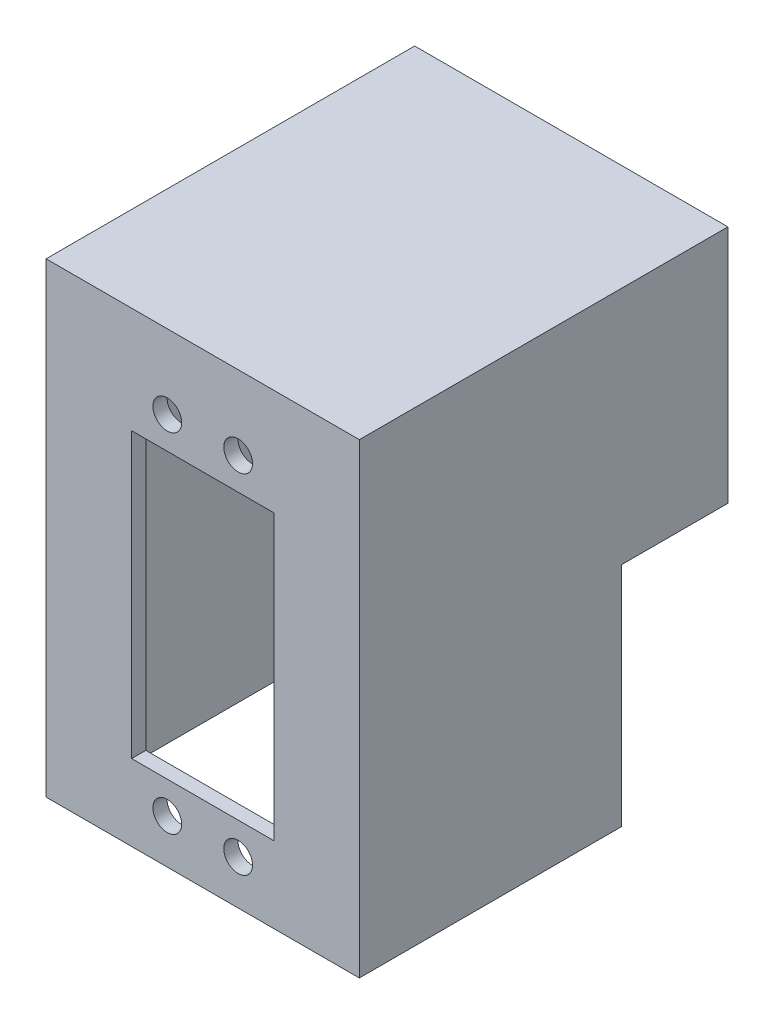
ISO-10303-21;
HEADER;
FILE_DESCRIPTION(('STEP AP214'),'2;1');
FILE_NAME('part.step','',(''),(''),'','','');
FILE_SCHEMA(('AUTOMOTIVE_DESIGN { 1 0 10303 214 1 1 1 1 }'));
ENDSEC;
DATA;
#1=APPLICATION_CONTEXT('core data for automotive mechanical design processes');
#2=APPLICATION_PROTOCOL_DEFINITION('international standard','automotive_design',2000,#1);
#3=PRODUCT_CONTEXT('',#1,'mechanical');
#4=PRODUCT('Part','Part','',(#3));
#5=PRODUCT_RELATED_PRODUCT_CATEGORY('part','',(#4));
#6=PRODUCT_DEFINITION_FORMATION('','',#4);
#7=PRODUCT_DEFINITION_CONTEXT('part definition',#1,'design');
#8=PRODUCT_DEFINITION('design','',#6,#7);
#9=PRODUCT_DEFINITION_SHAPE('','',#8);
#10=(LENGTH_UNIT() NAMED_UNIT(*) SI_UNIT(.MILLI.,.METRE.));
#11=(NAMED_UNIT(*) PLANE_ANGLE_UNIT() SI_UNIT($,.RADIAN.));
#12=(NAMED_UNIT(*) SI_UNIT($,.STERADIAN.) SOLID_ANGLE_UNIT());
#13=UNCERTAINTY_MEASURE_WITH_UNIT(LENGTH_MEASURE(1.E-05),#10,'distance_accuracy_value','');
#14=(GEOMETRIC_REPRESENTATION_CONTEXT(3) GLOBAL_UNCERTAINTY_ASSIGNED_CONTEXT((#13)) GLOBAL_UNIT_ASSIGNED_CONTEXT((#10,
#11,#12)) REPRESENTATION_CONTEXT('',''));
#15=CARTESIAN_POINT('',(0.,0.,0.));
#16=DIRECTION('',(0.,0.,1.));
#17=DIRECTION('',(1.,0.,0.));
#18=AXIS2_PLACEMENT_3D('',#15,#16,#17);
#19=CARTESIAN_POINT('',(-22.097892133789,63.7768931445433,-63.913377085332));
#20=DIRECTION('',(-1.,0.,0.));
#21=DIRECTION('',(0.,0.,1.));
#22=AXIS2_PLACEMENT_3D('',#19,#20,#21);
#23=PLANE('',#22);
#24=DIRECTION('',(0.,0.,-1.));
#25=VECTOR('',#24,1.);
#26=CARTESIAN_POINT('',(-22.097892133789,0.,-63.913377085332));
#27=LINE('',#26,#25);
#28=CARTESIAN_POINT('',(-22.097892133789,0.,69.));
#29=VERTEX_POINT('',#28);
#30=CARTESIAN_POINT('',(-22.097892133789,0.,32.));
#31=VERTEX_POINT('',#30);
#32=EDGE_CURVE('E256',#29,#31,#27,.T.);
#33=ORIENTED_EDGE('',*,*,#32,.F.);
#34=DIRECTION('',(0.,-1.,0.));
#35=VECTOR('',#34,1.);
#36=CARTESIAN_POINT('',(-22.097892133789,65.7768931445433,69.));
#37=LINE('',#36,#35);
#38=CARTESIAN_POINT('',(-22.097892133789,65.7768931445433,69.));
#39=VERTEX_POINT('',#38);
#40=EDGE_CURVE('E359',#39,#29,#37,.T.);
#41=ORIENTED_EDGE('',*,*,#40,.F.);
#42=DIRECTION('',(0.,0.,1.));
#43=VECTOR('',#42,1.);
#44=CARTESIAN_POINT('',(-22.097892133789,65.7768931445433,-63.913377085332));
#45=LINE('',#44,#43);
#46=CARTESIAN_POINT('',(-22.097892133789,65.7768931445433,17.));
#47=VERTEX_POINT('',#46);
#48=EDGE_CURVE('E285',#47,#39,#45,.T.);
#49=ORIENTED_EDGE('',*,*,#48,.F.);
#50=DIRECTION('',(0.,1.,0.));
#51=VECTOR('',#50,1.);
#52=CARTESIAN_POINT('',(-22.097892133789,63.7768931445433,17.));
#53=LINE('',#52,#51);
#54=CARTESIAN_POINT('',(-22.097892133789,32.,17.));
#55=VERTEX_POINT('',#54);
#56=EDGE_CURVE('E280',#55,#47,#53,.T.);
#57=ORIENTED_EDGE('',*,*,#56,.F.);
#58=DIRECTION('',(0.,0.,1.));
#59=VECTOR('',#58,1.);
#60=CARTESIAN_POINT('',(-22.097892133789,32.,0.));
#61=LINE('',#60,#59);
#62=CARTESIAN_POINT('',(-22.097892133789,32.,32.));
#63=VERTEX_POINT('',#62);
#64=EDGE_CURVE('E303',#55,#63,#61,.T.);
#65=ORIENTED_EDGE('',*,*,#64,.T.);
#66=DIRECTION('',(0.,1.,0.));
#67=VECTOR('',#66,1.);
#68=CARTESIAN_POINT('',(-22.097892133789,30.,32.));
#69=LINE('',#68,#67);
#70=EDGE_CURVE('E237',#31,#63,#69,.T.);
#71=ORIENTED_EDGE('',*,*,#70,.F.);
#72=EDGE_LOOP('',(#33,#41,#49,#57,#65,#71));
#73=FACE_BOUND('',#72,.T.);
#74=ADVANCED_FACE('F110',(#73),#23,.T.);
#75=CARTESIAN_POINT('',(0.,0.,0.));
#76=DIRECTION('',(0.,1.,0.));
#77=DIRECTION('',(0.,0.,1.));
#78=AXIS2_PLACEMENT_3D('',#75,#76,#77);
#79=PLANE('',#78);
#80=ORIENTED_EDGE('',*,*,#32,.T.);
#81=DIRECTION('',(-1.,0.,0.));
#82=VECTOR('',#81,1.);
#83=CARTESIAN_POINT('',(125.,0.,32.));
#84=LINE('',#83,#82);
#85=CARTESIAN_POINT('',(-20.097892133789,0.,32.));
#86=VERTEX_POINT('',#85);
#87=EDGE_CURVE('E249',#86,#31,#84,.T.);
#88=ORIENTED_EDGE('',*,*,#87,.F.);
#89=DIRECTION('',(0.,0.,1.));
#90=VECTOR('',#89,1.);
#91=CARTESIAN_POINT('',(-20.097892133789,0.,0.));
#92=LINE('',#91,#90);
#93=CARTESIAN_POINT('',(-20.097892133789,0.,67.));
#94=VERTEX_POINT('',#93);
#95=EDGE_CURVE('E236',#86,#94,#92,.T.);
#96=ORIENTED_EDGE('',*,*,#95,.T.);
#97=DIRECTION('',(1.,0.,0.));
#98=VECTOR('',#97,1.);
#99=CARTESIAN_POINT('',(-22.097892133789,0.,67.));
#100=LINE('',#99,#98);
#101=CARTESIAN_POINT('',(20.097892133789,0.,67.));
#102=VERTEX_POINT('',#101);
#103=EDGE_CURVE('E354',#94,#102,#100,.T.);
#104=ORIENTED_EDGE('',*,*,#103,.T.);
#105=DIRECTION('',(0.,0.,-1.));
#106=VECTOR('',#105,1.);
#107=CARTESIAN_POINT('',(20.097892133789,0.,0.));
#108=LINE('',#107,#106);
#109=CARTESIAN_POINT('',(20.097892133789,0.,32.));
#110=VERTEX_POINT('',#109);
#111=EDGE_CURVE('E247',#102,#110,#108,.T.);
#112=ORIENTED_EDGE('',*,*,#111,.T.);
#113=CARTESIAN_POINT('',(22.097892133789,0.,32.));
#114=VERTEX_POINT('',#113);
#115=EDGE_CURVE('E229',#114,#110,#84,.T.);
#116=ORIENTED_EDGE('',*,*,#115,.F.);
#117=DIRECTION('',(0.,0.,1.));
#118=VECTOR('',#117,1.);
#119=CARTESIAN_POINT('',(22.097892133789,0.,-63.913377085332));
#120=LINE('',#119,#118);
#121=CARTESIAN_POINT('',(22.097892133789,0.,69.));
#122=VERTEX_POINT('',#121);
#123=EDGE_CURVE('E243',#114,#122,#120,.T.);
#124=ORIENTED_EDGE('',*,*,#123,.T.);
#125=DIRECTION('',(1.,0.,0.));
#126=VECTOR('',#125,1.);
#127=CARTESIAN_POINT('',(-22.097892133789,0.,69.));
#128=LINE('',#127,#126);
#129=EDGE_CURVE('E362',#29,#122,#128,.T.);
#130=ORIENTED_EDGE('',*,*,#129,.F.);
#131=EDGE_LOOP('',(#80,#88,#96,#104,#112,#116,#124,#130));
#132=FACE_BOUND('',#131,.T.);
#133=ADVANCED_FACE('F112',(#132),#79,.F.);
#134=CARTESIAN_POINT('',(20.097892133789,45.534799839415,17.));
#135=DIRECTION('',(1.,0.,0.));
#136=DIRECTION('',(0.,0.,-1.));
#137=AXIS2_PLACEMENT_3D('',#134,#135,#136);
#138=PLANE('',#137);
#139=DIRECTION('',(0.,-1.,0.));
#140=VECTOR('',#139,1.);
#141=CARTESIAN_POINT('',(20.097892133789,63.7768931445433,17.));
#142=LINE('',#141,#140);
#143=CARTESIAN_POINT('',(20.097892133789,63.7768931445433,17.));
#144=VERTEX_POINT('',#143);
#145=CARTESIAN_POINT('',(20.097892133789,32.,17.));
#146=VERTEX_POINT('',#145);
#147=EDGE_CURVE('E271',#144,#146,#142,.T.);
#148=ORIENTED_EDGE('',*,*,#147,.T.);
#149=DIRECTION('',(0.,0.,1.));
#150=VECTOR('',#149,1.);
#151=CARTESIAN_POINT('',(20.097892133789,32.,17.));
#152=LINE('',#151,#150);
#153=CARTESIAN_POINT('',(20.097892133789,32.,32.));
#154=VERTEX_POINT('',#153);
#155=EDGE_CURVE('E375',#146,#154,#152,.T.);
#156=ORIENTED_EDGE('',*,*,#155,.T.);
#157=DIRECTION('',(0.,-1.,0.));
#158=VECTOR('',#157,1.);
#159=CARTESIAN_POINT('',(20.097892133789,45.534799839415,32.));
#160=LINE('',#159,#158);
#161=EDGE_CURVE('E374',#154,#110,#160,.T.);
#162=ORIENTED_EDGE('',*,*,#161,.T.);
#163=ORIENTED_EDGE('',*,*,#111,.F.);
#164=DIRECTION('',(0.,1.,0.));
#165=VECTOR('',#164,1.);
#166=CARTESIAN_POINT('',(20.097892133789,63.7768931445433,67.));
#167=LINE('',#166,#165);
#168=CARTESIAN_POINT('',(20.097892133789,63.7768931445433,67.));
#169=VERTEX_POINT('',#168);
#170=EDGE_CURVE('E259',#102,#169,#167,.T.);
#171=ORIENTED_EDGE('',*,*,#170,.T.);
#172=DIRECTION('',(0.,0.,1.));
#173=VECTOR('',#172,1.);
#174=CARTESIAN_POINT('',(20.097892133789,63.7768931445433,-63.913377085332));
#175=LINE('',#174,#173);
#176=EDGE_CURVE('E270',#144,#169,#175,.T.);
#177=ORIENTED_EDGE('',*,*,#176,.F.);
#178=EDGE_LOOP('',(#148,#156,#162,#163,#171,#177));
#179=FACE_BOUND('',#178,.T.);
#180=ADVANCED_FACE('F371',(#179),#138,.F.);
#181=CARTESIAN_POINT('',(-20.097892133789,45.534799839415,17.));
#182=DIRECTION('',(-1.,0.,0.));
#183=DIRECTION('',(0.,0.,1.));
#184=AXIS2_PLACEMENT_3D('',#181,#182,#183);
#185=PLANE('',#184);
#186=DIRECTION('',(0.,1.,0.));
#187=VECTOR('',#186,1.);
#188=CARTESIAN_POINT('',(-20.097892133789,45.534799839415,32.));
#189=LINE('',#188,#187);
#190=CARTESIAN_POINT('',(-20.097892133789,32.,32.));
#191=VERTEX_POINT('',#190);
#192=EDGE_CURVE('E376',#86,#191,#189,.T.);
#193=ORIENTED_EDGE('',*,*,#192,.T.);
#194=DIRECTION('',(0.,0.,-1.));
#195=VECTOR('',#194,1.);
#196=CARTESIAN_POINT('',(-20.097892133789,32.,17.));
#197=LINE('',#196,#195);
#198=CARTESIAN_POINT('',(-20.097892133789,32.,17.));
#199=VERTEX_POINT('',#198);
#200=EDGE_CURVE('E333',#191,#199,#197,.T.);
#201=ORIENTED_EDGE('',*,*,#200,.T.);
#202=DIRECTION('',(0.,1.,0.));
#203=VECTOR('',#202,1.);
#204=CARTESIAN_POINT('',(-20.097892133789,63.7768931445433,17.));
#205=LINE('',#204,#203);
#206=CARTESIAN_POINT('',(-20.097892133789,63.7768931445433,17.));
#207=VERTEX_POINT('',#206);
#208=EDGE_CURVE('E278',#199,#207,#205,.T.);
#209=ORIENTED_EDGE('',*,*,#208,.T.);
#210=DIRECTION('',(0.,0.,1.));
#211=VECTOR('',#210,1.);
#212=CARTESIAN_POINT('',(-20.097892133789,63.7768931445433,-63.913377085332));
#213=LINE('',#212,#211);
#214=CARTESIAN_POINT('',(-20.097892133789,63.7768931445433,67.));
#215=VERTEX_POINT('',#214);
#216=EDGE_CURVE('E288',#207,#215,#213,.T.);
#217=ORIENTED_EDGE('',*,*,#216,.T.);
#218=DIRECTION('',(0.,-1.,0.));
#219=VECTOR('',#218,1.);
#220=CARTESIAN_POINT('',(-20.097892133789,63.7768931445433,67.));
#221=LINE('',#220,#219);
#222=EDGE_CURVE('E255',#215,#94,#221,.T.);
#223=ORIENTED_EDGE('',*,*,#222,.T.);
#224=ORIENTED_EDGE('',*,*,#95,.F.);
#225=EDGE_LOOP('',(#193,#201,#209,#217,#223,#224));
#226=FACE_BOUND('',#225,.T.);
#227=ADVANCED_FACE('F407',(#226),#185,.F.);
#228=CARTESIAN_POINT('',(22.097892133789,63.7768931445433,-63.913377085332));
#229=DIRECTION('',(1.,0.,0.));
#230=DIRECTION('',(0.,0.,-1.));
#231=AXIS2_PLACEMENT_3D('',#228,#229,#230);
#232=PLANE('',#231);
#233=ORIENTED_EDGE('',*,*,#123,.F.);
#234=DIRECTION('',(0.,-1.,0.));
#235=VECTOR('',#234,1.);
#236=CARTESIAN_POINT('',(22.097892133789,30.,32.));
#237=LINE('',#236,#235);
#238=CARTESIAN_POINT('',(22.097892133789,32.,32.));
#239=VERTEX_POINT('',#238);
#240=EDGE_CURVE('E226',#239,#114,#237,.T.);
#241=ORIENTED_EDGE('',*,*,#240,.F.);
#242=DIRECTION('',(0.,0.,-1.));
#243=VECTOR('',#242,1.);
#244=CARTESIAN_POINT('',(22.097892133789,32.,0.));
#245=LINE('',#244,#243);
#246=CARTESIAN_POINT('',(22.097892133789,32.,17.));
#247=VERTEX_POINT('',#246);
#248=EDGE_CURVE('E301',#239,#247,#245,.T.);
#249=ORIENTED_EDGE('',*,*,#248,.T.);
#250=DIRECTION('',(0.,-1.,0.));
#251=VECTOR('',#250,1.);
#252=CARTESIAN_POINT('',(22.097892133789,63.7768931445433,17.));
#253=LINE('',#252,#251);
#254=CARTESIAN_POINT('',(22.097892133789,65.7768931445433,17.));
#255=VERTEX_POINT('',#254);
#256=EDGE_CURVE('E281',#255,#247,#253,.T.);
#257=ORIENTED_EDGE('',*,*,#256,.F.);
#258=DIRECTION('',(0.,0.,1.));
#259=VECTOR('',#258,1.);
#260=CARTESIAN_POINT('',(22.097892133789,65.7768931445433,-63.913377085332));
#261=LINE('',#260,#259);
#262=CARTESIAN_POINT('',(22.097892133789,65.7768931445433,69.));
#263=VERTEX_POINT('',#262);
#264=EDGE_CURVE('E291',#255,#263,#261,.T.);
#265=ORIENTED_EDGE('',*,*,#264,.T.);
#266=DIRECTION('',(0.,1.,0.));
#267=VECTOR('',#266,1.);
#268=CARTESIAN_POINT('',(22.097892133789,65.7768931445433,69.));
#269=LINE('',#268,#267);
#270=EDGE_CURVE('E254',#122,#263,#269,.T.);
#271=ORIENTED_EDGE('',*,*,#270,.F.);
#272=EDGE_LOOP('',(#233,#241,#249,#257,#265,#271));
#273=FACE_BOUND('',#272,.T.);
#274=ADVANCED_FACE('F252',(#273),#232,.T.);
#275=CARTESIAN_POINT('',(-20.097892133789,65.7768931445433,-63.913377085332));
#276=DIRECTION('',(0.,1.,0.));
#277=DIRECTION('',(0.,0.,1.));
#278=AXIS2_PLACEMENT_3D('',#275,#276,#277);
#279=PLANE('',#278);
#280=DIRECTION('',(1.,0.,0.));
#281=VECTOR('',#280,1.);
#282=CARTESIAN_POINT('',(-20.097892133789,65.7768931445433,17.));
#283=LINE('',#282,#281);
#284=EDGE_CURVE('E284',#47,#255,#283,.T.);
#285=ORIENTED_EDGE('',*,*,#284,.F.);
#286=ORIENTED_EDGE('',*,*,#48,.T.);
#287=DIRECTION('',(-1.,0.,0.));
#288=VECTOR('',#287,1.);
#289=CARTESIAN_POINT('',(-22.097892133789,65.7768931445433,69.));
#290=LINE('',#289,#288);
#291=EDGE_CURVE('E261',#263,#39,#290,.T.);
#292=ORIENTED_EDGE('',*,*,#291,.F.);
#293=ORIENTED_EDGE('',*,*,#264,.F.);
#294=EDGE_LOOP('',(#285,#286,#292,#293));
#295=FACE_BOUND('',#294,.T.);
#296=ADVANCED_FACE('F396',(#295),#279,.T.);
#297=CARTESIAN_POINT('',(-20.097892133789,63.7768931445433,-63.913377085332));
#298=DIRECTION('',(0.,1.,0.));
#299=DIRECTION('',(0.,0.,1.));
#300=AXIS2_PLACEMENT_3D('',#297,#298,#299);
#301=PLANE('',#300);
#302=ORIENTED_EDGE('',*,*,#216,.F.);
#303=DIRECTION('',(1.,0.,0.));
#304=VECTOR('',#303,1.);
#305=CARTESIAN_POINT('',(-20.097892133789,63.7768931445433,17.));
#306=LINE('',#305,#304);
#307=EDGE_CURVE('E275',#207,#144,#306,.T.);
#308=ORIENTED_EDGE('',*,*,#307,.T.);
#309=ORIENTED_EDGE('',*,*,#176,.T.);
#310=DIRECTION('',(-1.,0.,0.));
#311=VECTOR('',#310,1.);
#312=CARTESIAN_POINT('',(-20.097892133789,63.7768931445433,67.));
#313=LINE('',#312,#311);
#314=EDGE_CURVE('E267',#169,#215,#313,.T.);
#315=ORIENTED_EDGE('',*,*,#314,.T.);
#316=EDGE_LOOP('',(#302,#308,#309,#315));
#317=FACE_BOUND('',#316,.T.);
#318=ADVANCED_FACE('F412',(#317),#301,.F.);
#319=CARTESIAN_POINT('',(0.,0.,17.));
#320=DIRECTION('',(0.,0.,1.));
#321=DIRECTION('',(1.,0.,0.));
#322=AXIS2_PLACEMENT_3D('',#319,#320,#321);
#323=PLANE('',#322);
#324=DIRECTION('',(1.,0.,0.));
#325=VECTOR('',#324,1.);
#326=CARTESIAN_POINT('',(0.,32.,17.));
#327=LINE('',#326,#325);
#328=EDGE_CURVE('E297',#55,#199,#327,.T.);
#329=ORIENTED_EDGE('',*,*,#328,.F.);
#330=ORIENTED_EDGE('',*,*,#56,.T.);
#331=ORIENTED_EDGE('',*,*,#284,.T.);
#332=ORIENTED_EDGE('',*,*,#256,.T.);
#333=EDGE_CURVE('E274',#146,#247,#327,.T.);
#334=ORIENTED_EDGE('',*,*,#333,.F.);
#335=ORIENTED_EDGE('',*,*,#147,.F.);
#336=ORIENTED_EDGE('',*,*,#307,.F.);
#337=ORIENTED_EDGE('',*,*,#208,.F.);
#338=EDGE_LOOP('',(#329,#330,#331,#332,#334,#335,#336,#337));
#339=FACE_BOUND('',#338,.T.);
#340=ADVANCED_FACE('F391',(#339),#323,.F.);
#341=CARTESIAN_POINT('',(0.,0.,69.));
#342=DIRECTION('',(0.,0.,1.));
#343=DIRECTION('',(1.,0.,0.));
#344=AXIS2_PLACEMENT_3D('',#341,#342,#343);
#345=PLANE('',#344);
#346=CARTESIAN_POINT('',(-5.,55.3068931445433,69.));
#347=DIRECTION('',(0.,0.,1.));
#348=DIRECTION('',(1.,0.,0.));
#349=AXIS2_PLACEMENT_3D('',#346,#347,#348);
#350=CIRCLE('',#349,2.03);
#351=CARTESIAN_POINT('',(-2.97,55.3068931445433,69.));
#352=VERTEX_POINT('',#351);
#353=EDGE_CURVE('E322',#352,#352,#350,.T.);
#354=ORIENTED_EDGE('',*,*,#353,.F.);
#355=EDGE_LOOP('',(#354));
#356=FACE_BOUND('',#355,.T.);
#357=CARTESIAN_POINT('',(5.,55.3068931445433,69.));
#358=DIRECTION('',(0.,0.,1.));
#359=DIRECTION('',(1.,0.,0.));
#360=AXIS2_PLACEMENT_3D('',#357,#358,#359);
#361=CIRCLE('',#360,2.03);
#362=CARTESIAN_POINT('',(7.03,55.3068931445433,69.));
#363=VERTEX_POINT('',#362);
#364=EDGE_CURVE('E328',#363,#363,#361,.T.);
#365=ORIENTED_EDGE('',*,*,#364,.F.);
#366=EDGE_LOOP('',(#365));
#367=FACE_BOUND('',#366,.T.);
#368=CARTESIAN_POINT('',(-5.,6.24689314454328,69.));
#369=DIRECTION('',(0.,0.,1.));
#370=DIRECTION('',(1.,0.,0.));
#371=AXIS2_PLACEMENT_3D('',#368,#369,#370);
#372=CIRCLE('',#371,2.03);
#373=CARTESIAN_POINT('',(-2.97,6.24689314454328,69.));
#374=VERTEX_POINT('',#373);
#375=EDGE_CURVE('E318',#374,#374,#372,.T.);
#376=ORIENTED_EDGE('',*,*,#375,.F.);
#377=EDGE_LOOP('',(#376));
#378=FACE_BOUND('',#377,.T.);
#379=CARTESIAN_POINT('',(5.,6.24689314454328,69.));
#380=DIRECTION('',(0.,0.,1.));
#381=DIRECTION('',(1.,0.,0.));
#382=AXIS2_PLACEMENT_3D('',#379,#380,#381);
#383=CIRCLE('',#382,2.03);
#384=CARTESIAN_POINT('',(7.03,6.24689314454328,69.));
#385=VERTEX_POINT('',#384);
#386=EDGE_CURVE('E326',#385,#385,#383,.T.);
#387=ORIENTED_EDGE('',*,*,#386,.F.);
#388=EDGE_LOOP('',(#387));
#389=FACE_BOUND('',#388,.T.);
#390=DIRECTION('',(0.,1.,0.));
#391=VECTOR('',#390,1.);
#392=CARTESIAN_POINT('',(10.03,50.8068931445433,69.));
#393=LINE('',#392,#391);
#394=CARTESIAN_POINT('',(10.03,10.7468931445433,69.));
#395=VERTEX_POINT('',#394);
#396=CARTESIAN_POINT('',(10.03,50.8068931445433,69.));
#397=VERTEX_POINT('',#396);
#398=EDGE_CURVE('E127',#395,#397,#393,.T.);
#399=ORIENTED_EDGE('',*,*,#398,.F.);
#400=DIRECTION('',(1.,0.,0.));
#401=VECTOR('',#400,1.);
#402=CARTESIAN_POINT('',(-10.03,10.7468931445433,69.));
#403=LINE('',#402,#401);
#404=CARTESIAN_POINT('',(-10.03,10.7468931445433,69.));
#405=VERTEX_POINT('',#404);
#406=EDGE_CURVE('E348',#405,#395,#403,.T.);
#407=ORIENTED_EDGE('',*,*,#406,.F.);
#408=DIRECTION('',(0.,-1.,0.));
#409=VECTOR('',#408,1.);
#410=CARTESIAN_POINT('',(-10.03,50.8068931445433,69.));
#411=LINE('',#410,#409);
#412=CARTESIAN_POINT('',(-10.03,50.8068931445433,69.));
#413=VERTEX_POINT('',#412);
#414=EDGE_CURVE('E345',#413,#405,#411,.T.);
#415=ORIENTED_EDGE('',*,*,#414,.F.);
#416=DIRECTION('',(-1.,0.,0.));
#417=VECTOR('',#416,1.);
#418=CARTESIAN_POINT('',(-10.03,50.8068931445433,69.));
#419=LINE('',#418,#417);
#420=EDGE_CURVE('E343',#397,#413,#419,.T.);
#421=ORIENTED_EDGE('',*,*,#420,.F.);
#422=EDGE_LOOP('',(#399,#407,#415,#421));
#423=FACE_BOUND('',#422,.T.);
#424=ORIENTED_EDGE('',*,*,#40,.T.);
#425=ORIENTED_EDGE('',*,*,#129,.T.);
#426=ORIENTED_EDGE('',*,*,#270,.T.);
#427=ORIENTED_EDGE('',*,*,#291,.T.);
#428=EDGE_LOOP('',(#424,#425,#426,#427));
#429=FACE_BOUND('',#428,.T.);
#430=ADVANCED_FACE('F402',(#356,#367,#378,#389,#423,#429),#345,.T.);
#431=CARTESIAN_POINT('',(0.,0.,67.));
#432=DIRECTION('',(0.,0.,1.));
#433=DIRECTION('',(1.,0.,0.));
#434=AXIS2_PLACEMENT_3D('',#431,#432,#433);
#435=PLANE('',#434);
#436=CARTESIAN_POINT('',(-5.,55.3068931445433,67.));
#437=DIRECTION('',(0.,0.,1.));
#438=DIRECTION('',(1.,0.,0.));
#439=AXIS2_PLACEMENT_3D('',#436,#437,#438);
#440=CIRCLE('',#439,2.03);
#441=CARTESIAN_POINT('',(-2.97,55.3068931445433,67.));
#442=VERTEX_POINT('',#441);
#443=EDGE_CURVE('E114',#442,#442,#440,.T.);
#444=ORIENTED_EDGE('',*,*,#443,.T.);
#445=EDGE_LOOP('',(#444));
#446=FACE_BOUND('',#445,.T.);
#447=CARTESIAN_POINT('',(5.,55.3068931445433,67.));
#448=DIRECTION('',(0.,0.,1.));
#449=DIRECTION('',(1.,0.,0.));
#450=AXIS2_PLACEMENT_3D('',#447,#448,#449);
#451=CIRCLE('',#450,2.03);
#452=CARTESIAN_POINT('',(7.03,55.3068931445433,67.));
#453=VERTEX_POINT('',#452);
#454=EDGE_CURVE('E320',#453,#453,#451,.T.);
#455=ORIENTED_EDGE('',*,*,#454,.T.);
#456=EDGE_LOOP('',(#455));
#457=FACE_BOUND('',#456,.T.);
#458=CARTESIAN_POINT('',(-5.,6.24689314454328,67.));
#459=DIRECTION('',(0.,0.,1.));
#460=DIRECTION('',(1.,0.,0.));
#461=AXIS2_PLACEMENT_3D('',#458,#459,#460);
#462=CIRCLE('',#461,2.03);
#463=CARTESIAN_POINT('',(-2.97,6.24689314454328,67.));
#464=VERTEX_POINT('',#463);
#465=EDGE_CURVE('E317',#464,#464,#462,.T.);
#466=ORIENTED_EDGE('',*,*,#465,.T.);
#467=EDGE_LOOP('',(#466));
#468=FACE_BOUND('',#467,.T.);
#469=CARTESIAN_POINT('',(5.,6.24689314454328,67.));
#470=DIRECTION('',(0.,0.,1.));
#471=DIRECTION('',(1.,0.,0.));
#472=AXIS2_PLACEMENT_3D('',#469,#470,#471);
#473=CIRCLE('',#472,2.03);
#474=CARTESIAN_POINT('',(7.03,6.24689314454328,67.));
#475=VERTEX_POINT('',#474);
#476=EDGE_CURVE('E314',#475,#475,#473,.T.);
#477=ORIENTED_EDGE('',*,*,#476,.T.);
#478=EDGE_LOOP('',(#477));
#479=FACE_BOUND('',#478,.T.);
#480=DIRECTION('',(1.,0.,0.));
#481=VECTOR('',#480,1.);
#482=CARTESIAN_POINT('',(0.,10.7468931445433,67.));
#483=LINE('',#482,#481);
#484=CARTESIAN_POINT('',(-10.03,10.7468931445433,67.));
#485=VERTEX_POINT('',#484);
#486=CARTESIAN_POINT('',(10.03,10.7468931445433,67.));
#487=VERTEX_POINT('',#486);
#488=EDGE_CURVE('E119',#485,#487,#483,.T.);
#489=ORIENTED_EDGE('',*,*,#488,.T.);
#490=DIRECTION('',(0.,1.,0.));
#491=VECTOR('',#490,1.);
#492=CARTESIAN_POINT('',(10.03,0.,67.));
#493=LINE('',#492,#491);
#494=CARTESIAN_POINT('',(10.03,50.8068931445433,67.));
#495=VERTEX_POINT('',#494);
#496=EDGE_CURVE('E12',#487,#495,#493,.T.);
#497=ORIENTED_EDGE('',*,*,#496,.T.);
#498=DIRECTION('',(-1.,0.,0.));
#499=VECTOR('',#498,1.);
#500=CARTESIAN_POINT('',(0.,50.8068931445433,67.));
#501=LINE('',#500,#499);
#502=CARTESIAN_POINT('',(-10.03,50.8068931445433,67.));
#503=VERTEX_POINT('',#502);
#504=EDGE_CURVE('E306',#495,#503,#501,.T.);
#505=ORIENTED_EDGE('',*,*,#504,.T.);
#506=DIRECTION('',(0.,-1.,0.));
#507=VECTOR('',#506,1.);
#508=CARTESIAN_POINT('',(-10.03,0.,67.));
#509=LINE('',#508,#507);
#510=EDGE_CURVE('E309',#503,#485,#509,.T.);
#511=ORIENTED_EDGE('',*,*,#510,.T.);
#512=EDGE_LOOP('',(#489,#497,#505,#511));
#513=FACE_BOUND('',#512,.T.);
#514=ORIENTED_EDGE('',*,*,#222,.F.);
#515=ORIENTED_EDGE('',*,*,#314,.F.);
#516=ORIENTED_EDGE('',*,*,#170,.F.);
#517=ORIENTED_EDGE('',*,*,#103,.F.);
#518=EDGE_LOOP('',(#514,#515,#516,#517));
#519=FACE_BOUND('',#518,.T.);
#520=ADVANCED_FACE('F410',(#446,#457,#468,#479,#513,#519),#435,.F.);
#521=CARTESIAN_POINT('',(10.03,50.8068931445433,59.));
#522=DIRECTION('',(1.,0.,0.));
#523=DIRECTION('',(0.,1.,0.));
#524=AXIS2_PLACEMENT_3D('',#521,#522,#523);
#525=PLANE('',#524);
#526=DIRECTION('',(0.,0.,1.));
#527=VECTOR('',#526,1.);
#528=CARTESIAN_POINT('',(10.03,10.7468931445433,59.));
#529=LINE('',#528,#527);
#530=EDGE_CURVE('E352',#487,#395,#529,.T.);
#531=ORIENTED_EDGE('',*,*,#530,.T.);
#532=ORIENTED_EDGE('',*,*,#398,.T.);
#533=DIRECTION('',(0.,0.,1.));
#534=VECTOR('',#533,1.);
#535=CARTESIAN_POINT('',(10.03,50.8068931445433,59.));
#536=LINE('',#535,#534);
#537=EDGE_CURVE('E351',#495,#397,#536,.T.);
#538=ORIENTED_EDGE('',*,*,#537,.F.);
#539=ORIENTED_EDGE('',*,*,#496,.F.);
#540=EDGE_LOOP('',(#531,#532,#538,#539));
#541=FACE_BOUND('',#540,.T.);
#542=ADVANCED_FACE('F481',(#541),#525,.F.);
#543=CARTESIAN_POINT('',(-10.03,10.7468931445433,59.));
#544=DIRECTION('',(0.,-1.,0.));
#545=DIRECTION('',(0.,0.,-1.));
#546=AXIS2_PLACEMENT_3D('',#543,#544,#545);
#547=PLANE('',#546);
#548=DIRECTION('',(0.,0.,1.));
#549=VECTOR('',#548,1.);
#550=CARTESIAN_POINT('',(-10.03,10.7468931445433,59.));
#551=LINE('',#550,#549);
#552=EDGE_CURVE('E355',#485,#405,#551,.T.);
#553=ORIENTED_EDGE('',*,*,#552,.T.);
#554=ORIENTED_EDGE('',*,*,#406,.T.);
#555=ORIENTED_EDGE('',*,*,#530,.F.);
#556=ORIENTED_EDGE('',*,*,#488,.F.);
#557=EDGE_LOOP('',(#553,#554,#555,#556));
#558=FACE_BOUND('',#557,.T.);
#559=ADVANCED_FACE('F489',(#558),#547,.F.);
#560=CARTESIAN_POINT('',(-10.03,50.8068931445433,59.));
#561=DIRECTION('',(-1.,0.,0.));
#562=DIRECTION('',(0.,-1.,0.));
#563=AXIS2_PLACEMENT_3D('',#560,#561,#562);
#564=PLANE('',#563);
#565=DIRECTION('',(0.,0.,1.));
#566=VECTOR('',#565,1.);
#567=CARTESIAN_POINT('',(-10.03,50.8068931445433,59.));
#568=LINE('',#567,#566);
#569=EDGE_CURVE('E135',#503,#413,#568,.T.);
#570=ORIENTED_EDGE('',*,*,#569,.T.);
#571=ORIENTED_EDGE('',*,*,#414,.T.);
#572=ORIENTED_EDGE('',*,*,#552,.F.);
#573=ORIENTED_EDGE('',*,*,#510,.F.);
#574=EDGE_LOOP('',(#570,#571,#572,#573));
#575=FACE_BOUND('',#574,.T.);
#576=ADVANCED_FACE('F496',(#575),#564,.F.);
#577=CARTESIAN_POINT('',(-10.03,50.8068931445433,59.));
#578=DIRECTION('',(0.,1.,0.));
#579=DIRECTION('',(0.,0.,1.));
#580=AXIS2_PLACEMENT_3D('',#577,#578,#579);
#581=PLANE('',#580);
#582=ORIENTED_EDGE('',*,*,#537,.T.);
#583=ORIENTED_EDGE('',*,*,#420,.T.);
#584=ORIENTED_EDGE('',*,*,#569,.F.);
#585=ORIENTED_EDGE('',*,*,#504,.F.);
#586=EDGE_LOOP('',(#582,#583,#584,#585));
#587=FACE_BOUND('',#586,.T.);
#588=ADVANCED_FACE('F504',(#587),#581,.F.);
#589=CARTESIAN_POINT('',(5.,6.24689314454328,59.));
#590=DIRECTION('',(0.,0.,1.));
#591=DIRECTION('',(1.,0.,0.));
#592=AXIS2_PLACEMENT_3D('',#589,#590,#591);
#593=CYLINDRICAL_SURFACE('',#592,2.03);
#594=ORIENTED_EDGE('',*,*,#386,.T.);
#595=EDGE_LOOP('',(#594));
#596=FACE_BOUND('',#595,.T.);
#597=ORIENTED_EDGE('',*,*,#476,.F.);
#598=EDGE_LOOP('',(#597));
#599=FACE_BOUND('',#598,.T.);
#600=ADVANCED_FACE('F512',(#596,#599),#593,.F.);
#601=CARTESIAN_POINT('',(-5.,6.24689314454328,59.));
#602=DIRECTION('',(0.,0.,1.));
#603=DIRECTION('',(1.,0.,0.));
#604=AXIS2_PLACEMENT_3D('',#601,#602,#603);
#605=CYLINDRICAL_SURFACE('',#604,2.03);
#606=ORIENTED_EDGE('',*,*,#375,.T.);
#607=EDGE_LOOP('',(#606));
#608=FACE_BOUND('',#607,.T.);
#609=ORIENTED_EDGE('',*,*,#465,.F.);
#610=EDGE_LOOP('',(#609));
#611=FACE_BOUND('',#610,.T.);
#612=ADVANCED_FACE('F519',(#608,#611),#605,.F.);
#613=CARTESIAN_POINT('',(5.,55.3068931445433,59.));
#614=DIRECTION('',(0.,0.,1.));
#615=DIRECTION('',(1.,0.,0.));
#616=AXIS2_PLACEMENT_3D('',#613,#614,#615);
#617=CYLINDRICAL_SURFACE('',#616,2.03);
#618=ORIENTED_EDGE('',*,*,#364,.T.);
#619=EDGE_LOOP('',(#618));
#620=FACE_BOUND('',#619,.T.);
#621=ORIENTED_EDGE('',*,*,#454,.F.);
#622=EDGE_LOOP('',(#621));
#623=FACE_BOUND('',#622,.T.);
#624=ADVANCED_FACE('F423',(#620,#623),#617,.F.);
#625=CARTESIAN_POINT('',(-5.,55.3068931445433,59.));
#626=DIRECTION('',(0.,0.,1.));
#627=DIRECTION('',(1.,0.,0.));
#628=AXIS2_PLACEMENT_3D('',#625,#626,#627);
#629=CYLINDRICAL_SURFACE('',#628,2.03);
#630=ORIENTED_EDGE('',*,*,#353,.T.);
#631=EDGE_LOOP('',(#630));
#632=FACE_BOUND('',#631,.T.);
#633=ORIENTED_EDGE('',*,*,#443,.F.);
#634=EDGE_LOOP('',(#633));
#635=FACE_BOUND('',#634,.T.);
#636=ADVANCED_FACE('F416',(#632,#635),#629,.F.);
#637=CARTESIAN_POINT('',(125.,32.,-32.));
#638=DIRECTION('',(0.,1.,0.));
#639=DIRECTION('',(0.,0.,1.));
#640=AXIS2_PLACEMENT_3D('',#637,#638,#639);
#641=PLANE('',#640);
#642=DIRECTION('',(-1.,0.,0.));
#643=VECTOR('',#642,1.);
#644=CARTESIAN_POINT('',(125.,32.,32.));
#645=LINE('',#644,#643);
#646=EDGE_CURVE('E248',#191,#63,#645,.T.);
#647=ORIENTED_EDGE('',*,*,#646,.T.);
#648=ORIENTED_EDGE('',*,*,#64,.F.);
#649=ORIENTED_EDGE('',*,*,#328,.T.);
#650=ORIENTED_EDGE('',*,*,#200,.F.);
#651=EDGE_LOOP('',(#647,#648,#649,#650));
#652=FACE_BOUND('',#651,.T.);
#653=ADVANCED_FACE('F414',(#652),#641,.F.);
#654=CARTESIAN_POINT('',(125.,32.,32.));
#655=DIRECTION('',(0.,0.,1.));
#656=DIRECTION('',(1.,0.,0.));
#657=AXIS2_PLACEMENT_3D('',#654,#655,#656);
#658=PLANE('',#657);
#659=ORIENTED_EDGE('',*,*,#70,.T.);
#660=ORIENTED_EDGE('',*,*,#646,.F.);
#661=ORIENTED_EDGE('',*,*,#192,.F.);
#662=ORIENTED_EDGE('',*,*,#87,.T.);
#663=EDGE_LOOP('',(#659,#660,#661,#662));
#664=FACE_BOUND('',#663,.T.);
#665=ADVANCED_FACE('F404',(#664),#658,.F.);
#666=ORIENTED_EDGE('',*,*,#248,.F.);
#667=EDGE_CURVE('E232',#239,#154,#645,.T.);
#668=ORIENTED_EDGE('',*,*,#667,.T.);
#669=ORIENTED_EDGE('',*,*,#155,.F.);
#670=ORIENTED_EDGE('',*,*,#333,.T.);
#671=EDGE_LOOP('',(#666,#668,#669,#670));
#672=FACE_BOUND('',#671,.T.);
#673=ADVANCED_FACE('F385',(#672),#641,.F.);
#674=ORIENTED_EDGE('',*,*,#667,.F.);
#675=ORIENTED_EDGE('',*,*,#240,.T.);
#676=ORIENTED_EDGE('',*,*,#115,.T.);
#677=ORIENTED_EDGE('',*,*,#161,.F.);
#678=EDGE_LOOP('',(#674,#675,#676,#677));
#679=FACE_BOUND('',#678,.T.);
#680=ADVANCED_FACE('F228',(#679),#658,.F.);
#681=CLOSED_SHELL('',(#74,#133,#180,#227,#274,#296,#318,#340,#430,#520,#542,#559,#576,#588,#600,
#612,#624,#636,#653,#665,#673,#680));
#682=MANIFOLD_SOLID_BREP('B2',#681);
#683=ADVANCED_BREP_SHAPE_REPRESENTATION('',(#18,#682),#14);
#684=SHAPE_DEFINITION_REPRESENTATION(#9,#683);
ENDSEC;
END-ISO-10303-21;
